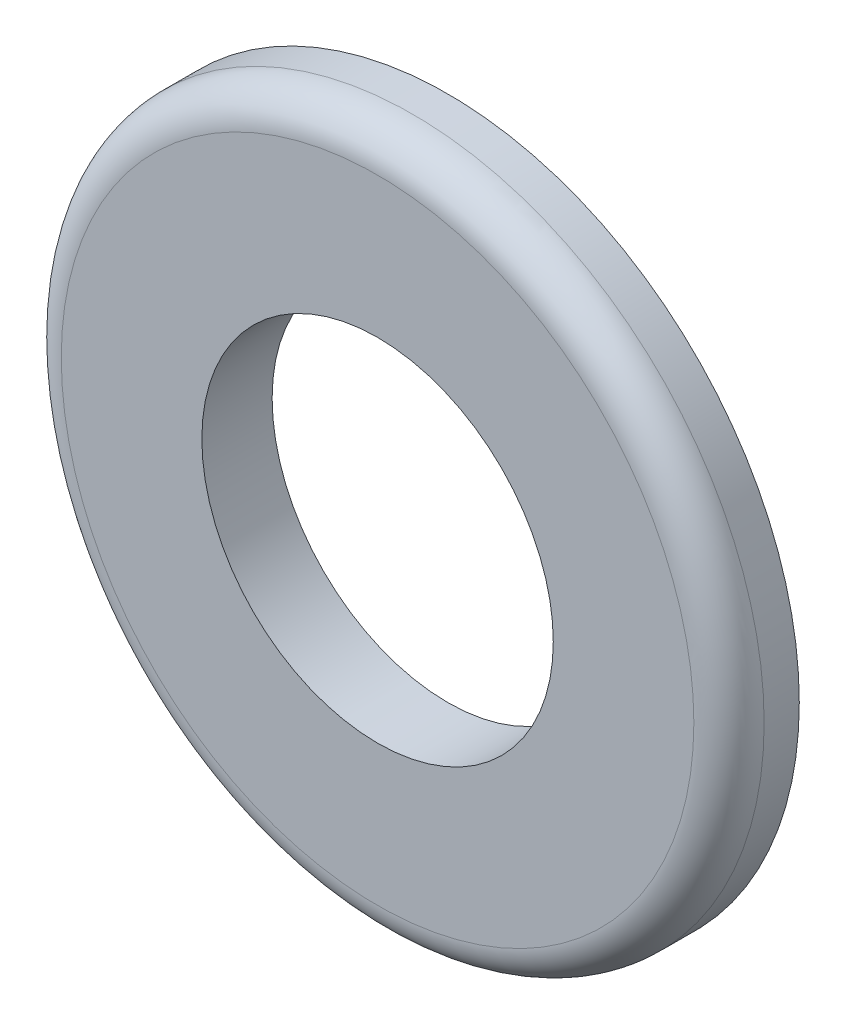
ISO-10303-21;
HEADER;
FILE_DESCRIPTION(('STEP AP214'),'2;1');
FILE_NAME('part.step','',(''),(''),'','','');
FILE_SCHEMA(('AUTOMOTIVE_DESIGN { 1 0 10303 214 1 1 1 1 }'));
ENDSEC;
DATA;
#1=APPLICATION_CONTEXT('core data for automotive mechanical design processes');
#2=APPLICATION_PROTOCOL_DEFINITION('international standard','automotive_design',2000,#1);
#3=PRODUCT_CONTEXT('',#1,'mechanical');
#4=PRODUCT('Part','Part','',(#3));
#5=PRODUCT_RELATED_PRODUCT_CATEGORY('part','',(#4));
#6=PRODUCT_DEFINITION_FORMATION('','',#4);
#7=PRODUCT_DEFINITION_CONTEXT('part definition',#1,'design');
#8=PRODUCT_DEFINITION('design','',#6,#7);
#9=PRODUCT_DEFINITION_SHAPE('','',#8);
#10=(LENGTH_UNIT() NAMED_UNIT(*) SI_UNIT(.MILLI.,.METRE.));
#11=(NAMED_UNIT(*) PLANE_ANGLE_UNIT() SI_UNIT($,.RADIAN.));
#12=(NAMED_UNIT(*) SI_UNIT($,.STERADIAN.) SOLID_ANGLE_UNIT());
#13=UNCERTAINTY_MEASURE_WITH_UNIT(LENGTH_MEASURE(1.E-05),#10,'distance_accuracy_value','');
#14=(GEOMETRIC_REPRESENTATION_CONTEXT(3) GLOBAL_UNCERTAINTY_ASSIGNED_CONTEXT((#13)) GLOBAL_UNIT_ASSIGNED_CONTEXT((#10,
#11,#12)) REPRESENTATION_CONTEXT('',''));
#15=CARTESIAN_POINT('',(0.,0.,0.));
#16=DIRECTION('',(0.,0.,1.));
#17=DIRECTION('',(1.,0.,0.));
#18=AXIS2_PLACEMENT_3D('',#15,#16,#17);
#19=CARTESIAN_POINT('',(0.,0.,1.));
#20=DIRECTION('',(0.,0.,1.));
#21=DIRECTION('',(1.,0.,0.));
#22=AXIS2_PLACEMENT_3D('',#19,#20,#21);
#23=PLANE('',#22);
#24=CARTESIAN_POINT('',(0.,0.,1.));
#25=DIRECTION('',(0.,0.,1.));
#26=DIRECTION('',(1.,0.,0.));
#27=AXIS2_PLACEMENT_3D('',#24,#25,#26);
#28=CIRCLE('',#27,4.5);
#29=CARTESIAN_POINT('',(4.5,0.,1.));
#30=VERTEX_POINT('',#29);
#31=EDGE_CURVE('E50',#30,#30,#28,.T.);
#32=ORIENTED_EDGE('',*,*,#31,.T.);
#33=EDGE_LOOP('',(#32));
#34=FACE_BOUND('',#33,.T.);
#35=CARTESIAN_POINT('',(0.,0.,1.));
#36=DIRECTION('',(0.,0.,1.));
#37=DIRECTION('',(1.,0.,0.));
#38=AXIS2_PLACEMENT_3D('',#35,#36,#37);
#39=CIRCLE('',#38,2.5);
#40=CARTESIAN_POINT('',(2.5,0.,1.));
#41=VERTEX_POINT('',#40);
#42=EDGE_CURVE('E63',#41,#41,#39,.T.);
#43=ORIENTED_EDGE('',*,*,#42,.F.);
#44=EDGE_LOOP('',(#43));
#45=FACE_BOUND('',#44,.T.);
#46=ADVANCED_FACE('F42',(#34,#45),#23,.T.);
#47=CARTESIAN_POINT('',(0.,0.,0.));
#48=DIRECTION('',(0.,0.,1.));
#49=DIRECTION('',(1.,0.,0.));
#50=AXIS2_PLACEMENT_3D('',#47,#48,#49);
#51=PLANE('',#50);
#52=CARTESIAN_POINT('',(0.,0.,0.));
#53=DIRECTION('',(0.,0.,1.));
#54=DIRECTION('',(1.,0.,0.));
#55=AXIS2_PLACEMENT_3D('',#52,#53,#54);
#56=CIRCLE('',#55,5.);
#57=CARTESIAN_POINT('',(5.,0.,0.));
#58=VERTEX_POINT('',#57);
#59=EDGE_CURVE('E57',#58,#58,#56,.T.);
#60=ORIENTED_EDGE('',*,*,#59,.F.);
#61=EDGE_LOOP('',(#60));
#62=FACE_BOUND('',#61,.T.);
#63=CARTESIAN_POINT('',(0.,0.,0.));
#64=DIRECTION('',(0.,0.,1.));
#65=DIRECTION('',(1.,0.,0.));
#66=AXIS2_PLACEMENT_3D('',#63,#64,#65);
#67=CIRCLE('',#66,2.5);
#68=CARTESIAN_POINT('',(2.5,0.,0.));
#69=VERTEX_POINT('',#68);
#70=EDGE_CURVE('E66',#69,#69,#67,.T.);
#71=ORIENTED_EDGE('',*,*,#70,.T.);
#72=EDGE_LOOP('',(#71));
#73=FACE_BOUND('',#72,.T.);
#74=ADVANCED_FACE('F78',(#62,#73),#51,.F.);
#75=CARTESIAN_POINT('',(0.,0.,1.));
#76=DIRECTION('',(0.,0.,-1.));
#77=DIRECTION('',(-1.,0.,0.));
#78=AXIS2_PLACEMENT_3D('',#75,#76,#77);
#79=CYLINDRICAL_SURFACE('',#78,5.);
#80=CARTESIAN_POINT('',(0.,0.,0.5));
#81=DIRECTION('',(0.,0.,1.));
#82=DIRECTION('',(1.,0.,0.));
#83=AXIS2_PLACEMENT_3D('',#80,#81,#82);
#84=CIRCLE('',#83,5.);
#85=CARTESIAN_POINT('',(5.,0.,0.5));
#86=VERTEX_POINT('',#85);
#87=EDGE_CURVE('E11',#86,#86,#84,.F.);
#88=ORIENTED_EDGE('',*,*,#87,.T.);
#89=EDGE_LOOP('',(#88));
#90=FACE_BOUND('',#89,.T.);
#91=ORIENTED_EDGE('',*,*,#59,.T.);
#92=EDGE_LOOP('',(#91));
#93=FACE_BOUND('',#92,.T.);
#94=ADVANCED_FACE('F83',(#90,#93),#79,.T.);
#95=CARTESIAN_POINT('',(0.,0.,1.));
#96=DIRECTION('',(0.,0.,-1.));
#97=DIRECTION('',(-1.,0.,0.));
#98=AXIS2_PLACEMENT_3D('',#95,#96,#97);
#99=CYLINDRICAL_SURFACE('',#98,2.5);
#100=ORIENTED_EDGE('',*,*,#42,.T.);
#101=EDGE_LOOP('',(#100));
#102=FACE_BOUND('',#101,.T.);
#103=ORIENTED_EDGE('',*,*,#70,.F.);
#104=EDGE_LOOP('',(#103));
#105=FACE_BOUND('',#104,.T.);
#106=ADVANCED_FACE('F74',(#102,#105),#99,.F.);
#107=CARTESIAN_POINT('',(0.,0.,0.5));
#108=DIRECTION('',(0.,0.,1.));
#109=DIRECTION('',(1.,0.,0.));
#110=AXIS2_PLACEMENT_3D('',#107,#108,#109);
#111=TOROIDAL_SURFACE('',#110,4.5,0.5);
#112=ORIENTED_EDGE('',*,*,#87,.F.);
#113=EDGE_LOOP('',(#112));
#114=FACE_BOUND('',#113,.T.);
#115=ORIENTED_EDGE('',*,*,#31,.F.);
#116=EDGE_LOOP('',(#115));
#117=FACE_BOUND('',#116,.T.);
#118=ADVANCED_FACE('F44',(#114,#117),#111,.T.);
#119=CLOSED_SHELL('',(#46,#74,#94,#106,#118));
#120=MANIFOLD_SOLID_BREP('B2',#119);
#121=ADVANCED_BREP_SHAPE_REPRESENTATION('',(#18,#120),#14);
#122=SHAPE_DEFINITION_REPRESENTATION(#9,#121);
ENDSEC;
END-ISO-10303-21;
